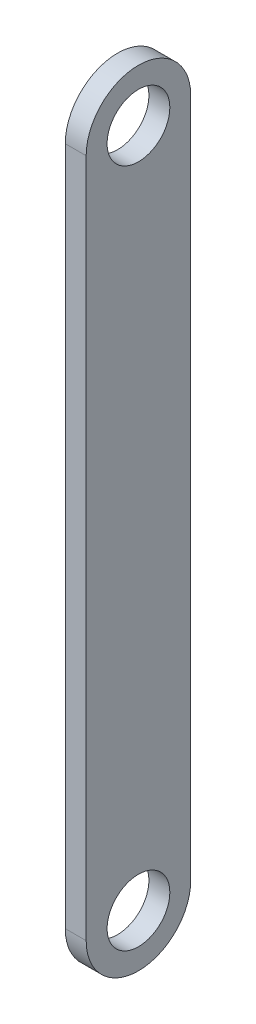
ISO-10303-21;
HEADER;
FILE_DESCRIPTION(('STEP AP214'),'2;1');
FILE_NAME('part.step','',(''),(''),'','','');
FILE_SCHEMA(('AUTOMOTIVE_DESIGN { 1 0 10303 214 1 1 1 1 }'));
ENDSEC;
DATA;
#1=APPLICATION_CONTEXT('core data for automotive mechanical design processes');
#2=APPLICATION_PROTOCOL_DEFINITION('international standard','automotive_design',2000,#1);
#3=PRODUCT_CONTEXT('',#1,'mechanical');
#4=PRODUCT('Part','Part','',(#3));
#5=PRODUCT_RELATED_PRODUCT_CATEGORY('part','',(#4));
#6=PRODUCT_DEFINITION_FORMATION('','',#4);
#7=PRODUCT_DEFINITION_CONTEXT('part definition',#1,'design');
#8=PRODUCT_DEFINITION('design','',#6,#7);
#9=PRODUCT_DEFINITION_SHAPE('','',#8);
#10=(LENGTH_UNIT() NAMED_UNIT(*) SI_UNIT(.MILLI.,.METRE.));
#11=(NAMED_UNIT(*) PLANE_ANGLE_UNIT() SI_UNIT($,.RADIAN.));
#12=(NAMED_UNIT(*) SI_UNIT($,.STERADIAN.) SOLID_ANGLE_UNIT());
#13=UNCERTAINTY_MEASURE_WITH_UNIT(LENGTH_MEASURE(1.E-05),#10,'distance_accuracy_value','');
#14=(GEOMETRIC_REPRESENTATION_CONTEXT(3) GLOBAL_UNCERTAINTY_ASSIGNED_CONTEXT((#13)) GLOBAL_UNIT_ASSIGNED_CONTEXT((#10,
#11,#12)) REPRESENTATION_CONTEXT('',''));
#15=CARTESIAN_POINT('',(0.,0.,0.));
#16=DIRECTION('',(0.,0.,1.));
#17=DIRECTION('',(1.,0.,0.));
#18=AXIS2_PLACEMENT_3D('',#15,#16,#17);
#19=CARTESIAN_POINT('',(2.,-32.5,0.));
#20=DIRECTION('',(1.,0.,0.));
#21=DIRECTION('',(0.,0.,-1.));
#22=AXIS2_PLACEMENT_3D('',#19,#20,#21);
#23=PLANE('',#22);
#24=CARTESIAN_POINT('',(2.,32.5,0.));
#25=DIRECTION('',(1.,0.,0.));
#26=DIRECTION('',(0.,0.,-1.));
#27=AXIS2_PLACEMENT_3D('',#24,#25,#26);
#28=CIRCLE('',#27,3.);
#29=CARTESIAN_POINT('',(2.,32.5,-3.));
#30=VERTEX_POINT('',#29);
#31=EDGE_CURVE('E112',#30,#30,#28,.T.);
#32=ORIENTED_EDGE('',*,*,#31,.F.);
#33=EDGE_LOOP('',(#32));
#34=FACE_BOUND('',#33,.T.);
#35=CARTESIAN_POINT('',(2.,-32.5,0.));
#36=DIRECTION('',(1.,0.,0.));
#37=DIRECTION('',(0.,0.,-1.));
#38=AXIS2_PLACEMENT_3D('',#35,#36,#37);
#39=CIRCLE('',#38,5.);
#40=CARTESIAN_POINT('',(2.,-32.5,5.));
#41=VERTEX_POINT('',#40);
#42=CARTESIAN_POINT('',(2.,-32.5,-5.));
#43=VERTEX_POINT('',#42);
#44=EDGE_CURVE('E92',#41,#43,#39,.T.);
#45=ORIENTED_EDGE('',*,*,#44,.T.);
#46=DIRECTION('',(0.,1.,0.));
#47=VECTOR('',#46,1.);
#48=CARTESIAN_POINT('',(2.,-32.5,-5.));
#49=LINE('',#48,#47);
#50=CARTESIAN_POINT('',(2.,32.5,-5.));
#51=VERTEX_POINT('',#50);
#52=EDGE_CURVE('E87',#43,#51,#49,.T.);
#53=ORIENTED_EDGE('',*,*,#52,.T.);
#54=CARTESIAN_POINT('',(2.,32.5,0.));
#55=DIRECTION('',(1.,0.,0.));
#56=DIRECTION('',(0.,0.,-1.));
#57=AXIS2_PLACEMENT_3D('',#54,#55,#56);
#58=CIRCLE('',#57,5.);
#59=CARTESIAN_POINT('',(2.,32.5,5.00000000000001));
#60=VERTEX_POINT('',#59);
#61=EDGE_CURVE('E90',#51,#60,#58,.T.);
#62=ORIENTED_EDGE('',*,*,#61,.T.);
#63=DIRECTION('',(0.,-1.,0.));
#64=VECTOR('',#63,1.);
#65=CARTESIAN_POINT('',(2.,-32.5,5.));
#66=LINE('',#65,#64);
#67=EDGE_CURVE('E57',#60,#41,#66,.T.);
#68=ORIENTED_EDGE('',*,*,#67,.T.);
#69=EDGE_LOOP('',(#45,#53,#62,#68));
#70=FACE_BOUND('',#69,.T.);
#71=CARTESIAN_POINT('',(2.,-32.5,0.));
#72=DIRECTION('',(1.,0.,0.));
#73=DIRECTION('',(0.,0.,-1.));
#74=AXIS2_PLACEMENT_3D('',#71,#72,#73);
#75=CIRCLE('',#74,3.);
#76=CARTESIAN_POINT('',(2.,-32.5,-3.));
#77=VERTEX_POINT('',#76);
#78=EDGE_CURVE('E134',#77,#77,#75,.T.);
#79=ORIENTED_EDGE('',*,*,#78,.F.);
#80=EDGE_LOOP('',(#79));
#81=FACE_BOUND('',#80,.T.);
#82=ADVANCED_FACE('F39',(#34,#70,#81),#23,.T.);
#83=CARTESIAN_POINT('',(0.,-32.5,0.));
#84=DIRECTION('',(1.,0.,0.));
#85=DIRECTION('',(0.,0.,-1.));
#86=AXIS2_PLACEMENT_3D('',#83,#84,#85);
#87=PLANE('',#86);
#88=CARTESIAN_POINT('',(0.,-32.5,0.));
#89=DIRECTION('',(1.,0.,0.));
#90=DIRECTION('',(0.,0.,-1.));
#91=AXIS2_PLACEMENT_3D('',#88,#89,#90);
#92=CIRCLE('',#91,5.);
#93=CARTESIAN_POINT('',(0.,-32.5,5.));
#94=VERTEX_POINT('',#93);
#95=CARTESIAN_POINT('',(0.,-32.5,-5.));
#96=VERTEX_POINT('',#95);
#97=EDGE_CURVE('E108',#94,#96,#92,.T.);
#98=ORIENTED_EDGE('',*,*,#97,.F.);
#99=DIRECTION('',(0.,-1.,0.));
#100=VECTOR('',#99,1.);
#101=CARTESIAN_POINT('',(0.,-32.5,5.));
#102=LINE('',#101,#100);
#103=CARTESIAN_POINT('',(0.,32.5,5.00000000000001));
#104=VERTEX_POINT('',#103);
#105=EDGE_CURVE('E80',#104,#94,#102,.T.);
#106=ORIENTED_EDGE('',*,*,#105,.F.);
#107=CARTESIAN_POINT('',(0.,32.5,0.));
#108=DIRECTION('',(1.,0.,0.));
#109=DIRECTION('',(0.,0.,-1.));
#110=AXIS2_PLACEMENT_3D('',#107,#108,#109);
#111=CIRCLE('',#110,5.);
#112=CARTESIAN_POINT('',(0.,32.5,-5.));
#113=VERTEX_POINT('',#112);
#114=EDGE_CURVE('E74',#113,#104,#111,.T.);
#115=ORIENTED_EDGE('',*,*,#114,.F.);
#116=DIRECTION('',(0.,1.,0.));
#117=VECTOR('',#116,1.);
#118=CARTESIAN_POINT('',(0.,-32.5,-5.));
#119=LINE('',#118,#117);
#120=EDGE_CURVE('E97',#96,#113,#119,.T.);
#121=ORIENTED_EDGE('',*,*,#120,.F.);
#122=EDGE_LOOP('',(#98,#106,#115,#121));
#123=FACE_BOUND('',#122,.T.);
#124=CARTESIAN_POINT('',(0.,32.5,0.));
#125=DIRECTION('',(1.,0.,0.));
#126=DIRECTION('',(0.,0.,-1.));
#127=AXIS2_PLACEMENT_3D('',#124,#125,#126);
#128=CIRCLE('',#127,3.);
#129=CARTESIAN_POINT('',(0.,32.5,-3.));
#130=VERTEX_POINT('',#129);
#131=EDGE_CURVE('E130',#130,#130,#128,.T.);
#132=ORIENTED_EDGE('',*,*,#131,.T.);
#133=EDGE_LOOP('',(#132));
#134=FACE_BOUND('',#133,.T.);
#135=CARTESIAN_POINT('',(0.,-32.5,0.));
#136=DIRECTION('',(1.,0.,0.));
#137=DIRECTION('',(0.,0.,-1.));
#138=AXIS2_PLACEMENT_3D('',#135,#136,#137);
#139=CIRCLE('',#138,3.);
#140=CARTESIAN_POINT('',(0.,-32.5,-3.));
#141=VERTEX_POINT('',#140);
#142=EDGE_CURVE('E138',#141,#141,#139,.T.);
#143=ORIENTED_EDGE('',*,*,#142,.T.);
#144=EDGE_LOOP('',(#143));
#145=FACE_BOUND('',#144,.T.);
#146=ADVANCED_FACE('F125',(#123,#134,#145),#87,.F.);
#147=CARTESIAN_POINT('',(2.,-32.5,0.));
#148=DIRECTION('',(-1.,0.,0.));
#149=DIRECTION('',(0.,0.,1.));
#150=AXIS2_PLACEMENT_3D('',#147,#148,#149);
#151=CYLINDRICAL_SURFACE('',#150,5.);
#152=ORIENTED_EDGE('',*,*,#97,.T.);
#153=DIRECTION('',(-1.,0.,0.));
#154=VECTOR('',#153,1.);
#155=CARTESIAN_POINT('',(2.,-32.5,-5.));
#156=LINE('',#155,#154);
#157=EDGE_CURVE('E11',#43,#96,#156,.T.);
#158=ORIENTED_EDGE('',*,*,#157,.F.);
#159=ORIENTED_EDGE('',*,*,#44,.F.);
#160=DIRECTION('',(-1.,0.,0.));
#161=VECTOR('',#160,1.);
#162=CARTESIAN_POINT('',(2.,-32.5,5.));
#163=LINE('',#162,#161);
#164=EDGE_CURVE('E104',#41,#94,#163,.T.);
#165=ORIENTED_EDGE('',*,*,#164,.T.);
#166=EDGE_LOOP('',(#152,#158,#159,#165));
#167=FACE_BOUND('',#166,.T.);
#168=ADVANCED_FACE('F41',(#167),#151,.T.);
#169=CARTESIAN_POINT('',(2.,-32.5,-5.));
#170=DIRECTION('',(0.,0.,1.));
#171=DIRECTION('',(0.,-1.,0.));
#172=AXIS2_PLACEMENT_3D('',#169,#170,#171);
#173=PLANE('',#172);
#174=ORIENTED_EDGE('',*,*,#120,.T.);
#175=DIRECTION('',(-1.,0.,0.));
#176=VECTOR('',#175,1.);
#177=CARTESIAN_POINT('',(2.,32.5,-5.));
#178=LINE('',#177,#176);
#179=EDGE_CURVE('E49',#51,#113,#178,.T.);
#180=ORIENTED_EDGE('',*,*,#179,.F.);
#181=ORIENTED_EDGE('',*,*,#52,.F.);
#182=ORIENTED_EDGE('',*,*,#157,.T.);
#183=EDGE_LOOP('',(#174,#180,#181,#182));
#184=FACE_BOUND('',#183,.T.);
#185=ADVANCED_FACE('F96',(#184),#173,.F.);
#186=CARTESIAN_POINT('',(2.,32.5,0.));
#187=DIRECTION('',(-1.,0.,0.));
#188=DIRECTION('',(0.,0.,1.));
#189=AXIS2_PLACEMENT_3D('',#186,#187,#188);
#190=CYLINDRICAL_SURFACE('',#189,5.);
#191=ORIENTED_EDGE('',*,*,#114,.T.);
#192=DIRECTION('',(-1.,0.,0.));
#193=VECTOR('',#192,1.);
#194=CARTESIAN_POINT('',(2.,32.5,5.00000000000001));
#195=LINE('',#194,#193);
#196=EDGE_CURVE('E99',#60,#104,#195,.T.);
#197=ORIENTED_EDGE('',*,*,#196,.F.);
#198=ORIENTED_EDGE('',*,*,#61,.F.);
#199=ORIENTED_EDGE('',*,*,#179,.T.);
#200=EDGE_LOOP('',(#191,#197,#198,#199));
#201=FACE_BOUND('',#200,.T.);
#202=ADVANCED_FACE('F100',(#201),#190,.T.);
#203=CARTESIAN_POINT('',(2.,-32.5,5.));
#204=DIRECTION('',(0.,0.,-1.));
#205=DIRECTION('',(0.,1.,0.));
#206=AXIS2_PLACEMENT_3D('',#203,#204,#205);
#207=PLANE('',#206);
#208=ORIENTED_EDGE('',*,*,#105,.T.);
#209=ORIENTED_EDGE('',*,*,#164,.F.);
#210=ORIENTED_EDGE('',*,*,#67,.F.);
#211=ORIENTED_EDGE('',*,*,#196,.T.);
#212=EDGE_LOOP('',(#208,#209,#210,#211));
#213=FACE_BOUND('',#212,.T.);
#214=ADVANCED_FACE('F122',(#213),#207,.F.);
#215=CARTESIAN_POINT('',(2.,32.5,0.));
#216=DIRECTION('',(-1.,0.,0.));
#217=DIRECTION('',(0.,0.,1.));
#218=AXIS2_PLACEMENT_3D('',#215,#216,#217);
#219=CYLINDRICAL_SURFACE('',#218,3.);
#220=ORIENTED_EDGE('',*,*,#31,.T.);
#221=EDGE_LOOP('',(#220));
#222=FACE_BOUND('',#221,.T.);
#223=ORIENTED_EDGE('',*,*,#131,.F.);
#224=EDGE_LOOP('',(#223));
#225=FACE_BOUND('',#224,.T.);
#226=ADVANCED_FACE('F157',(#222,#225),#219,.F.);
#227=CARTESIAN_POINT('',(2.,-32.5,0.));
#228=DIRECTION('',(-1.,0.,0.));
#229=DIRECTION('',(0.,0.,1.));
#230=AXIS2_PLACEMENT_3D('',#227,#228,#229);
#231=CYLINDRICAL_SURFACE('',#230,3.);
#232=ORIENTED_EDGE('',*,*,#78,.T.);
#233=EDGE_LOOP('',(#232));
#234=FACE_BOUND('',#233,.T.);
#235=ORIENTED_EDGE('',*,*,#142,.F.);
#236=EDGE_LOOP('',(#235));
#237=FACE_BOUND('',#236,.T.);
#238=ADVANCED_FACE('F146',(#234,#237),#231,.F.);
#239=CLOSED_SHELL('',(#82,#146,#168,#185,#202,#214,#226,#238));
#240=MANIFOLD_SOLID_BREP('B2',#239);
#241=ADVANCED_BREP_SHAPE_REPRESENTATION('',(#18,#240),#14);
#242=SHAPE_DEFINITION_REPRESENTATION(#9,#241);
ENDSEC;
END-ISO-10303-21;
